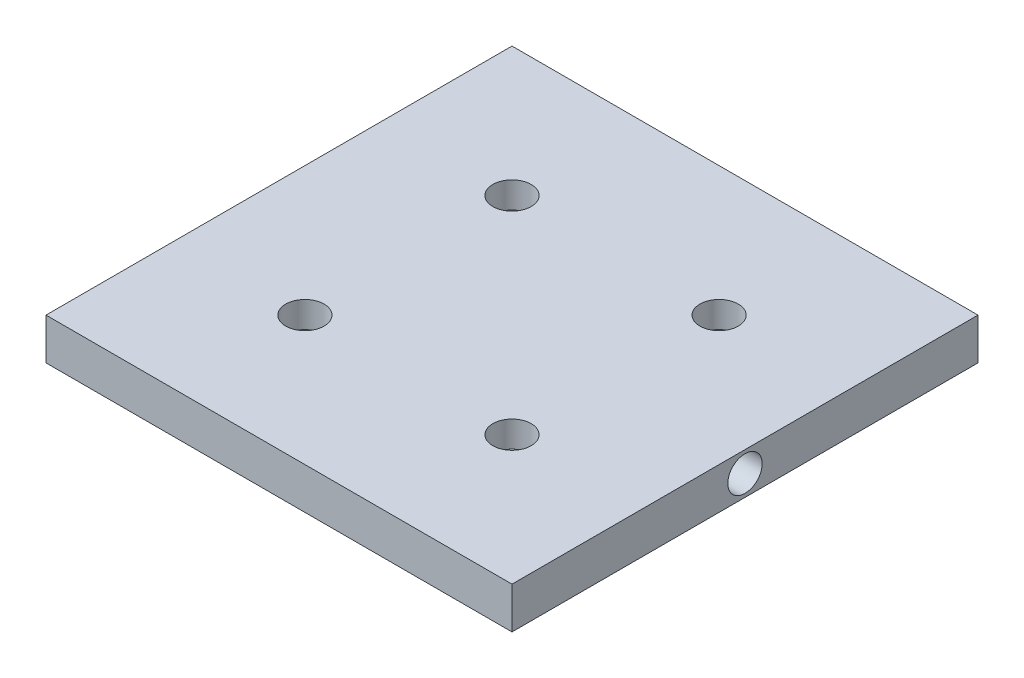
ISO-10303-21;
HEADER;
FILE_DESCRIPTION(('STEP AP214'),'2;1');
FILE_NAME('part.step','',(''),(''),'','','');
FILE_SCHEMA(('AUTOMOTIVE_DESIGN { 1 0 10303 214 1 1 1 1 }'));
ENDSEC;
DATA;
#1=APPLICATION_CONTEXT('core data for automotive mechanical design processes');
#2=APPLICATION_PROTOCOL_DEFINITION('international standard','automotive_design',2000,#1);
#3=PRODUCT_CONTEXT('',#1,'mechanical');
#4=PRODUCT('Part','Part','',(#3));
#5=PRODUCT_RELATED_PRODUCT_CATEGORY('part','',(#4));
#6=PRODUCT_DEFINITION_FORMATION('','',#4);
#7=PRODUCT_DEFINITION_CONTEXT('part definition',#1,'design');
#8=PRODUCT_DEFINITION('design','',#6,#7);
#9=PRODUCT_DEFINITION_SHAPE('','',#8);
#10=(LENGTH_UNIT() NAMED_UNIT(*) SI_UNIT(.MILLI.,.METRE.));
#11=(NAMED_UNIT(*) PLANE_ANGLE_UNIT() SI_UNIT($,.RADIAN.));
#12=(NAMED_UNIT(*) SI_UNIT($,.STERADIAN.) SOLID_ANGLE_UNIT());
#13=UNCERTAINTY_MEASURE_WITH_UNIT(LENGTH_MEASURE(1.E-05),#10,'distance_accuracy_value','');
#14=(GEOMETRIC_REPRESENTATION_CONTEXT(3) GLOBAL_UNCERTAINTY_ASSIGNED_CONTEXT((#13)) GLOBAL_UNIT_ASSIGNED_CONTEXT((#10,
#11,#12)) REPRESENTATION_CONTEXT('',''));
#15=CARTESIAN_POINT('',(0.,0.,0.));
#16=DIRECTION('',(0.,0.,1.));
#17=DIRECTION('',(1.,0.,0.));
#18=AXIS2_PLACEMENT_3D('',#15,#16,#17);
#19=CARTESIAN_POINT('',(-57.15,10.16,-57.15));
#20=DIRECTION('',(1.,0.,0.));
#21=DIRECTION('',(0.,0.,-1.));
#22=AXIS2_PLACEMENT_3D('',#19,#20,#21);
#23=PLANE('',#22);
#24=DIRECTION('',(0.,0.,1.));
#25=VECTOR('',#24,1.);
#26=CARTESIAN_POINT('',(-57.15,0.,-57.15));
#27=LINE('',#26,#25);
#28=CARTESIAN_POINT('',(-57.15,0.,-57.15));
#29=VERTEX_POINT('',#28);
#30=CARTESIAN_POINT('',(-57.15,0.,57.1499999999999));
#31=VERTEX_POINT('',#30);
#32=EDGE_CURVE('E111',#29,#31,#27,.T.);
#33=ORIENTED_EDGE('',*,*,#32,.T.);
#34=DIRECTION('',(0.,-1.,0.));
#35=VECTOR('',#34,1.);
#36=CARTESIAN_POINT('',(-57.15,10.16,57.1499999999999));
#37=LINE('',#36,#35);
#38=CARTESIAN_POINT('',(-57.15,10.16,57.1499999999999));
#39=VERTEX_POINT('',#38);
#40=EDGE_CURVE('E11',#39,#31,#37,.T.);
#41=ORIENTED_EDGE('',*,*,#40,.F.);
#42=DIRECTION('',(0.,0.,1.));
#43=VECTOR('',#42,1.);
#44=CARTESIAN_POINT('',(-57.15,10.16,-57.15));
#45=LINE('',#44,#43);
#46=CARTESIAN_POINT('',(-57.15,10.16,-57.15));
#47=VERTEX_POINT('',#46);
#48=EDGE_CURVE('E95',#47,#39,#45,.T.);
#49=ORIENTED_EDGE('',*,*,#48,.F.);
#50=DIRECTION('',(0.,-1.,0.));
#51=VECTOR('',#50,1.);
#52=CARTESIAN_POINT('',(-57.15,10.16,-57.15));
#53=LINE('',#52,#51);
#54=EDGE_CURVE('E107',#47,#29,#53,.T.);
#55=ORIENTED_EDGE('',*,*,#54,.T.);
#56=EDGE_LOOP('',(#33,#41,#49,#55));
#57=FACE_BOUND('',#56,.T.);
#58=ADVANCED_FACE('F43',(#57),#23,.F.);
#59=CARTESIAN_POINT('',(-57.15,10.16,57.1499999999999));
#60=DIRECTION('',(0.,0.,-1.));
#61=DIRECTION('',(-1.,0.,0.));
#62=AXIS2_PLACEMENT_3D('',#59,#60,#61);
#63=PLANE('',#62);
#64=DIRECTION('',(1.,0.,0.));
#65=VECTOR('',#64,1.);
#66=CARTESIAN_POINT('',(-57.15,0.,57.1499999999999));
#67=LINE('',#66,#65);
#68=CARTESIAN_POINT('',(57.15,0.,57.1499999999999));
#69=VERTEX_POINT('',#68);
#70=EDGE_CURVE('E100',#31,#69,#67,.T.);
#71=ORIENTED_EDGE('',*,*,#70,.T.);
#72=DIRECTION('',(0.,-1.,0.));
#73=VECTOR('',#72,1.);
#74=CARTESIAN_POINT('',(57.15,10.16,57.1499999999999));
#75=LINE('',#74,#73);
#76=CARTESIAN_POINT('',(57.15,10.16,57.1499999999999));
#77=VERTEX_POINT('',#76);
#78=EDGE_CURVE('E52',#77,#69,#75,.T.);
#79=ORIENTED_EDGE('',*,*,#78,.F.);
#80=DIRECTION('',(1.,0.,0.));
#81=VECTOR('',#80,1.);
#82=CARTESIAN_POINT('',(-57.15,10.16,57.1499999999999));
#83=LINE('',#82,#81);
#84=EDGE_CURVE('E90',#39,#77,#83,.T.);
#85=ORIENTED_EDGE('',*,*,#84,.F.);
#86=ORIENTED_EDGE('',*,*,#40,.T.);
#87=EDGE_LOOP('',(#71,#79,#85,#86));
#88=FACE_BOUND('',#87,.T.);
#89=ADVANCED_FACE('F99',(#88),#63,.F.);
#90=CARTESIAN_POINT('',(57.1499999999999,10.16,-57.1500000000001));
#91=DIRECTION('',(-1.,0.,0.));
#92=DIRECTION('',(0.,0.,1.));
#93=AXIS2_PLACEMENT_3D('',#90,#91,#92);
#94=PLANE('',#93);
#95=CARTESIAN_POINT('',(57.15,5.08,0.));
#96=DIRECTION('',(1.,0.,0.));
#97=DIRECTION('',(0.,0.,-1.));
#98=AXIS2_PLACEMENT_3D('',#95,#96,#97);
#99=CIRCLE('',#98,4.2164);
#100=CARTESIAN_POINT('',(57.15,5.08,-4.21640000000003));
#101=VERTEX_POINT('',#100);
#102=EDGE_CURVE('E196',#101,#101,#99,.T.);
#103=ORIENTED_EDGE('',*,*,#102,.F.);
#104=EDGE_LOOP('',(#103));
#105=FACE_BOUND('',#104,.T.);
#106=DIRECTION('',(0.,0.,-1.));
#107=VECTOR('',#106,1.);
#108=CARTESIAN_POINT('',(57.1499999999999,0.,-57.1500000000001));
#109=LINE('',#108,#107);
#110=CARTESIAN_POINT('',(57.1499999999999,0.,-57.1500000000001));
#111=VERTEX_POINT('',#110);
#112=EDGE_CURVE('E77',#69,#111,#109,.T.);
#113=ORIENTED_EDGE('',*,*,#112,.T.);
#114=DIRECTION('',(0.,-1.,0.));
#115=VECTOR('',#114,1.);
#116=CARTESIAN_POINT('',(57.1499999999999,10.16,-57.1500000000001));
#117=LINE('',#116,#115);
#118=CARTESIAN_POINT('',(57.1499999999999,10.16,-57.1500000000001));
#119=VERTEX_POINT('',#118);
#120=EDGE_CURVE('E102',#119,#111,#117,.T.);
#121=ORIENTED_EDGE('',*,*,#120,.F.);
#122=DIRECTION('',(0.,0.,-1.));
#123=VECTOR('',#122,1.);
#124=CARTESIAN_POINT('',(57.1499999999999,10.16,-57.1500000000001));
#125=LINE('',#124,#123);
#126=EDGE_CURVE('E93',#77,#119,#125,.T.);
#127=ORIENTED_EDGE('',*,*,#126,.F.);
#128=ORIENTED_EDGE('',*,*,#78,.T.);
#129=EDGE_LOOP('',(#113,#121,#127,#128));
#130=FACE_BOUND('',#129,.T.);
#131=ADVANCED_FACE('F103',(#105,#130),#94,.F.);
#132=CARTESIAN_POINT('',(-57.15,10.16,-57.15));
#133=DIRECTION('',(0.,0.,1.));
#134=DIRECTION('',(1.,0.,0.));
#135=AXIS2_PLACEMENT_3D('',#132,#133,#134);
#136=PLANE('',#135);
#137=DIRECTION('',(-1.,0.,0.));
#138=VECTOR('',#137,1.);
#139=CARTESIAN_POINT('',(-57.15,0.,-57.15));
#140=LINE('',#139,#138);
#141=EDGE_CURVE('E83',#111,#29,#140,.T.);
#142=ORIENTED_EDGE('',*,*,#141,.T.);
#143=ORIENTED_EDGE('',*,*,#54,.F.);
#144=DIRECTION('',(-1.,0.,0.));
#145=VECTOR('',#144,1.);
#146=CARTESIAN_POINT('',(-57.15,10.16,-57.15));
#147=LINE('',#146,#145);
#148=EDGE_CURVE('E60',#119,#47,#147,.T.);
#149=ORIENTED_EDGE('',*,*,#148,.F.);
#150=ORIENTED_EDGE('',*,*,#120,.T.);
#151=EDGE_LOOP('',(#142,#143,#149,#150));
#152=FACE_BOUND('',#151,.T.);
#153=ADVANCED_FACE('F125',(#152),#136,.F.);
#154=CARTESIAN_POINT('',(0.,10.16,0.));
#155=DIRECTION('',(0.,1.,0.));
#156=DIRECTION('',(0.,0.,1.));
#157=AXIS2_PLACEMENT_3D('',#154,#155,#156);
#158=PLANE('',#157);
#159=CARTESIAN_POINT('',(-25.4,10.16,-25.4000000000001));
#160=DIRECTION('',(0.,1.,0.));
#161=DIRECTION('',(0.,0.,1.));
#162=AXIS2_PLACEMENT_3D('',#159,#160,#161);
#163=CIRCLE('',#162,4.7);
#164=CARTESIAN_POINT('',(-25.4,10.16,-20.7000000000001));
#165=VERTEX_POINT('',#164);
#166=EDGE_CURVE('E191',#165,#165,#163,.T.);
#167=ORIENTED_EDGE('',*,*,#166,.F.);
#168=EDGE_LOOP('',(#167));
#169=FACE_BOUND('',#168,.T.);
#170=CARTESIAN_POINT('',(25.4,10.16,-25.4000000000002));
#171=DIRECTION('',(0.,1.,0.));
#172=DIRECTION('',(0.,0.,1.));
#173=AXIS2_PLACEMENT_3D('',#170,#171,#172);
#174=CIRCLE('',#173,4.7);
#175=CARTESIAN_POINT('',(25.4,10.16,-20.7000000000002));
#176=VERTEX_POINT('',#175);
#177=EDGE_CURVE('E175',#176,#176,#174,.T.);
#178=ORIENTED_EDGE('',*,*,#177,.F.);
#179=EDGE_LOOP('',(#178));
#180=FACE_BOUND('',#179,.T.);
#181=CARTESIAN_POINT('',(25.3999999999999,10.16,25.3999999999998));
#182=DIRECTION('',(0.,1.,0.));
#183=DIRECTION('',(0.,0.,1.));
#184=AXIS2_PLACEMENT_3D('',#181,#182,#183);
#185=CIRCLE('',#184,4.7);
#186=CARTESIAN_POINT('',(25.3999999999999,10.16,30.0999999999998));
#187=VERTEX_POINT('',#186);
#188=EDGE_CURVE('E159',#187,#187,#185,.T.);
#189=ORIENTED_EDGE('',*,*,#188,.F.);
#190=EDGE_LOOP('',(#189));
#191=FACE_BOUND('',#190,.T.);
#192=CARTESIAN_POINT('',(-25.4,10.16,25.3999999999999));
#193=DIRECTION('',(0.,1.,0.));
#194=DIRECTION('',(0.,0.,1.));
#195=AXIS2_PLACEMENT_3D('',#192,#193,#194);
#196=CIRCLE('',#195,4.7);
#197=CARTESIAN_POINT('',(-25.4,10.16,30.0999999999999));
#198=VERTEX_POINT('',#197);
#199=EDGE_CURVE('E143',#198,#198,#196,.T.);
#200=ORIENTED_EDGE('',*,*,#199,.F.);
#201=EDGE_LOOP('',(#200));
#202=FACE_BOUND('',#201,.T.);
#203=ORIENTED_EDGE('',*,*,#48,.T.);
#204=ORIENTED_EDGE('',*,*,#84,.T.);
#205=ORIENTED_EDGE('',*,*,#126,.T.);
#206=ORIENTED_EDGE('',*,*,#148,.T.);
#207=EDGE_LOOP('',(#203,#204,#205,#206));
#208=FACE_BOUND('',#207,.T.);
#209=ADVANCED_FACE('F91',(#169,#180,#191,#202,#208),#158,.T.);
#210=CARTESIAN_POINT('',(0.,0.,0.));
#211=DIRECTION('',(0.,1.,0.));
#212=DIRECTION('',(0.,0.,1.));
#213=AXIS2_PLACEMENT_3D('',#210,#211,#212);
#214=PLANE('',#213);
#215=CARTESIAN_POINT('',(-25.4,0.,-25.4000000000001));
#216=DIRECTION('',(0.,1.,0.));
#217=DIRECTION('',(0.,0.,1.));
#218=AXIS2_PLACEMENT_3D('',#215,#216,#217);
#219=CIRCLE('',#218,3.3);
#220=CARTESIAN_POINT('',(-25.4,0.,-22.1000000000001));
#221=VERTEX_POINT('',#220);
#222=EDGE_CURVE('E179',#221,#221,#219,.T.);
#223=ORIENTED_EDGE('',*,*,#222,.T.);
#224=EDGE_LOOP('',(#223));
#225=FACE_BOUND('',#224,.T.);
#226=CARTESIAN_POINT('',(25.4,0.,-25.4000000000002));
#227=DIRECTION('',(0.,1.,0.));
#228=DIRECTION('',(0.,0.,1.));
#229=AXIS2_PLACEMENT_3D('',#226,#227,#228);
#230=CIRCLE('',#229,3.3);
#231=CARTESIAN_POINT('',(25.4,0.,-22.1000000000002));
#232=VERTEX_POINT('',#231);
#233=EDGE_CURVE('E163',#232,#232,#230,.T.);
#234=ORIENTED_EDGE('',*,*,#233,.T.);
#235=EDGE_LOOP('',(#234));
#236=FACE_BOUND('',#235,.T.);
#237=CARTESIAN_POINT('',(25.3999999999999,0.,25.3999999999998));
#238=DIRECTION('',(0.,1.,0.));
#239=DIRECTION('',(0.,0.,1.));
#240=AXIS2_PLACEMENT_3D('',#237,#238,#239);
#241=CIRCLE('',#240,3.3);
#242=CARTESIAN_POINT('',(25.3999999999999,0.,28.6999999999998));
#243=VERTEX_POINT('',#242);
#244=EDGE_CURVE('E147',#243,#243,#241,.T.);
#245=ORIENTED_EDGE('',*,*,#244,.T.);
#246=EDGE_LOOP('',(#245));
#247=FACE_BOUND('',#246,.T.);
#248=CARTESIAN_POINT('',(-25.4,0.,25.3999999999999));
#249=DIRECTION('',(0.,1.,0.));
#250=DIRECTION('',(0.,0.,1.));
#251=AXIS2_PLACEMENT_3D('',#248,#249,#250);
#252=CIRCLE('',#251,3.3);
#253=CARTESIAN_POINT('',(-25.4,0.,28.6999999999999));
#254=VERTEX_POINT('',#253);
#255=EDGE_CURVE('E115',#254,#254,#252,.T.);
#256=ORIENTED_EDGE('',*,*,#255,.T.);
#257=EDGE_LOOP('',(#256));
#258=FACE_BOUND('',#257,.T.);
#259=ORIENTED_EDGE('',*,*,#32,.F.);
#260=ORIENTED_EDGE('',*,*,#141,.F.);
#261=ORIENTED_EDGE('',*,*,#112,.F.);
#262=ORIENTED_EDGE('',*,*,#70,.F.);
#263=EDGE_LOOP('',(#259,#260,#261,#262));
#264=FACE_BOUND('',#263,.T.);
#265=ADVANCED_FACE('F128',(#225,#236,#247,#258,#264),#214,.F.);
#266=CARTESIAN_POINT('',(-25.4,10.16,25.3999999999999));
#267=DIRECTION('',(0.,1.,0.));
#268=DIRECTION('',(0.,0.,1.));
#269=AXIS2_PLACEMENT_3D('',#266,#267,#268);
#270=CYLINDRICAL_SURFACE('',#269,3.3);
#271=ORIENTED_EDGE('',*,*,#255,.F.);
#272=EDGE_LOOP('',(#271));
#273=FACE_BOUND('',#272,.T.);
#274=CARTESIAN_POINT('',(-25.4,3.76,25.3999999999999));
#275=DIRECTION('',(0.,1.,0.));
#276=DIRECTION('',(0.,0.,1.));
#277=AXIS2_PLACEMENT_3D('',#274,#275,#276);
#278=CIRCLE('',#277,3.3);
#279=CARTESIAN_POINT('',(-25.4,3.76,28.6999999999999));
#280=VERTEX_POINT('',#279);
#281=EDGE_CURVE('E135',#280,#280,#278,.T.);
#282=ORIENTED_EDGE('',*,*,#281,.T.);
#283=EDGE_LOOP('',(#282));
#284=FACE_BOUND('',#283,.T.);
#285=ADVANCED_FACE('F255',(#273,#284),#270,.F.);
#286=CARTESIAN_POINT('',(-22.1000000000001,3.76,25.3999999999999));
#287=DIRECTION('',(0.,-1.,0.));
#288=DIRECTION('',(0.,0.,-1.));
#289=AXIS2_PLACEMENT_3D('',#286,#287,#288);
#290=PLANE('',#289);
#291=ORIENTED_EDGE('',*,*,#281,.F.);
#292=EDGE_LOOP('',(#291));
#293=FACE_BOUND('',#292,.T.);
#294=CARTESIAN_POINT('',(-25.4,3.76,25.3999999999999));
#295=DIRECTION('',(0.,1.,0.));
#296=DIRECTION('',(0.,0.,1.));
#297=AXIS2_PLACEMENT_3D('',#294,#295,#296);
#298=CIRCLE('',#297,4.7);
#299=CARTESIAN_POINT('',(-25.4,3.76,30.0999999999999));
#300=VERTEX_POINT('',#299);
#301=EDGE_CURVE('E139',#300,#300,#298,.T.);
#302=ORIENTED_EDGE('',*,*,#301,.T.);
#303=EDGE_LOOP('',(#302));
#304=FACE_BOUND('',#303,.T.);
#305=ADVANCED_FACE('F266',(#293,#304),#290,.F.);
#306=CARTESIAN_POINT('',(-25.4,10.16,25.3999999999999));
#307=DIRECTION('',(0.,1.,0.));
#308=DIRECTION('',(0.,0.,1.));
#309=AXIS2_PLACEMENT_3D('',#306,#307,#308);
#310=CYLINDRICAL_SURFACE('',#309,4.7);
#311=ORIENTED_EDGE('',*,*,#301,.F.);
#312=EDGE_LOOP('',(#311));
#313=FACE_BOUND('',#312,.T.);
#314=ORIENTED_EDGE('',*,*,#199,.T.);
#315=EDGE_LOOP('',(#314));
#316=FACE_BOUND('',#315,.T.);
#317=ADVANCED_FACE('F277',(#313,#316),#310,.F.);
#318=CARTESIAN_POINT('',(25.3999999999999,10.16,25.3999999999998));
#319=DIRECTION('',(0.,1.,0.));
#320=DIRECTION('',(0.,0.,1.));
#321=AXIS2_PLACEMENT_3D('',#318,#319,#320);
#322=CYLINDRICAL_SURFACE('',#321,3.3);
#323=ORIENTED_EDGE('',*,*,#244,.F.);
#324=EDGE_LOOP('',(#323));
#325=FACE_BOUND('',#324,.T.);
#326=CARTESIAN_POINT('',(25.3999999999999,3.76,25.3999999999998));
#327=DIRECTION('',(0.,1.,0.));
#328=DIRECTION('',(0.,0.,1.));
#329=AXIS2_PLACEMENT_3D('',#326,#327,#328);
#330=CIRCLE('',#329,3.3);
#331=CARTESIAN_POINT('',(25.3999999999999,3.76,28.6999999999998));
#332=VERTEX_POINT('',#331);
#333=EDGE_CURVE('E151',#332,#332,#330,.T.);
#334=ORIENTED_EDGE('',*,*,#333,.T.);
#335=EDGE_LOOP('',(#334));
#336=FACE_BOUND('',#335,.T.);
#337=ADVANCED_FACE('F288',(#325,#336),#322,.F.);
#338=CARTESIAN_POINT('',(28.6999999999999,3.76,25.3999999999998));
#339=DIRECTION('',(0.,-1.,0.));
#340=DIRECTION('',(0.,0.,-1.));
#341=AXIS2_PLACEMENT_3D('',#338,#339,#340);
#342=PLANE('',#341);
#343=ORIENTED_EDGE('',*,*,#333,.F.);
#344=EDGE_LOOP('',(#343));
#345=FACE_BOUND('',#344,.T.);
#346=CARTESIAN_POINT('',(25.3999999999999,3.76,25.3999999999998));
#347=DIRECTION('',(0.,1.,0.));
#348=DIRECTION('',(0.,0.,1.));
#349=AXIS2_PLACEMENT_3D('',#346,#347,#348);
#350=CIRCLE('',#349,4.7);
#351=CARTESIAN_POINT('',(25.3999999999999,3.76,30.0999999999998));
#352=VERTEX_POINT('',#351);
#353=EDGE_CURVE('E155',#352,#352,#350,.T.);
#354=ORIENTED_EDGE('',*,*,#353,.T.);
#355=EDGE_LOOP('',(#354));
#356=FACE_BOUND('',#355,.T.);
#357=ADVANCED_FACE('F299',(#345,#356),#342,.F.);
#358=CARTESIAN_POINT('',(25.3999999999999,10.16,25.3999999999998));
#359=DIRECTION('',(0.,1.,0.));
#360=DIRECTION('',(0.,0.,1.));
#361=AXIS2_PLACEMENT_3D('',#358,#359,#360);
#362=CYLINDRICAL_SURFACE('',#361,4.7);
#363=ORIENTED_EDGE('',*,*,#353,.F.);
#364=EDGE_LOOP('',(#363));
#365=FACE_BOUND('',#364,.T.);
#366=ORIENTED_EDGE('',*,*,#188,.T.);
#367=EDGE_LOOP('',(#366));
#368=FACE_BOUND('',#367,.T.);
#369=ADVANCED_FACE('F310',(#365,#368),#362,.F.);
#370=CARTESIAN_POINT('',(25.4,10.16,-25.4000000000002));
#371=DIRECTION('',(0.,1.,0.));
#372=DIRECTION('',(0.,0.,1.));
#373=AXIS2_PLACEMENT_3D('',#370,#371,#372);
#374=CYLINDRICAL_SURFACE('',#373,3.3);
#375=ORIENTED_EDGE('',*,*,#233,.F.);
#376=EDGE_LOOP('',(#375));
#377=FACE_BOUND('',#376,.T.);
#378=CARTESIAN_POINT('',(25.4,3.76,-25.4000000000002));
#379=DIRECTION('',(0.,1.,0.));
#380=DIRECTION('',(0.,0.,1.));
#381=AXIS2_PLACEMENT_3D('',#378,#379,#380);
#382=CIRCLE('',#381,3.3);
#383=CARTESIAN_POINT('',(25.4,3.76,-22.1000000000002));
#384=VERTEX_POINT('',#383);
#385=EDGE_CURVE('E167',#384,#384,#382,.T.);
#386=ORIENTED_EDGE('',*,*,#385,.T.);
#387=EDGE_LOOP('',(#386));
#388=FACE_BOUND('',#387,.T.);
#389=ADVANCED_FACE('F321',(#377,#388),#374,.F.);
#390=CARTESIAN_POINT('',(28.7,3.76,-25.4000000000002));
#391=DIRECTION('',(0.,-1.,0.));
#392=DIRECTION('',(0.,0.,-1.));
#393=AXIS2_PLACEMENT_3D('',#390,#391,#392);
#394=PLANE('',#393);
#395=ORIENTED_EDGE('',*,*,#385,.F.);
#396=EDGE_LOOP('',(#395));
#397=FACE_BOUND('',#396,.T.);
#398=CARTESIAN_POINT('',(25.4,3.76,-25.4000000000002));
#399=DIRECTION('',(0.,1.,0.));
#400=DIRECTION('',(0.,0.,1.));
#401=AXIS2_PLACEMENT_3D('',#398,#399,#400);
#402=CIRCLE('',#401,4.7);
#403=CARTESIAN_POINT('',(25.4,3.76,-20.7000000000002));
#404=VERTEX_POINT('',#403);
#405=EDGE_CURVE('E171',#404,#404,#402,.T.);
#406=ORIENTED_EDGE('',*,*,#405,.T.);
#407=EDGE_LOOP('',(#406));
#408=FACE_BOUND('',#407,.T.);
#409=ADVANCED_FACE('F332',(#397,#408),#394,.F.);
#410=CARTESIAN_POINT('',(25.4,10.16,-25.4000000000002));
#411=DIRECTION('',(0.,1.,0.));
#412=DIRECTION('',(0.,0.,1.));
#413=AXIS2_PLACEMENT_3D('',#410,#411,#412);
#414=CYLINDRICAL_SURFACE('',#413,4.7);
#415=ORIENTED_EDGE('',*,*,#405,.F.);
#416=EDGE_LOOP('',(#415));
#417=FACE_BOUND('',#416,.T.);
#418=ORIENTED_EDGE('',*,*,#177,.T.);
#419=EDGE_LOOP('',(#418));
#420=FACE_BOUND('',#419,.T.);
#421=ADVANCED_FACE('F343',(#417,#420),#414,.F.);
#422=CARTESIAN_POINT('',(-25.4,10.16,-25.4000000000001));
#423=DIRECTION('',(0.,1.,0.));
#424=DIRECTION('',(0.,0.,1.));
#425=AXIS2_PLACEMENT_3D('',#422,#423,#424);
#426=CYLINDRICAL_SURFACE('',#425,3.3);
#427=ORIENTED_EDGE('',*,*,#222,.F.);
#428=EDGE_LOOP('',(#427));
#429=FACE_BOUND('',#428,.T.);
#430=CARTESIAN_POINT('',(-25.4,3.76,-25.4000000000001));
#431=DIRECTION('',(0.,1.,0.));
#432=DIRECTION('',(0.,0.,1.));
#433=AXIS2_PLACEMENT_3D('',#430,#431,#432);
#434=CIRCLE('',#433,3.3);
#435=CARTESIAN_POINT('',(-25.4,3.76,-22.1000000000001));
#436=VERTEX_POINT('',#435);
#437=EDGE_CURVE('E183',#436,#436,#434,.T.);
#438=ORIENTED_EDGE('',*,*,#437,.T.);
#439=EDGE_LOOP('',(#438));
#440=FACE_BOUND('',#439,.T.);
#441=ADVANCED_FACE('F354',(#429,#440),#426,.F.);
#442=CARTESIAN_POINT('',(-22.1,3.76,-25.4000000000001));
#443=DIRECTION('',(0.,-1.,0.));
#444=DIRECTION('',(0.,0.,-1.));
#445=AXIS2_PLACEMENT_3D('',#442,#443,#444);
#446=PLANE('',#445);
#447=ORIENTED_EDGE('',*,*,#437,.F.);
#448=EDGE_LOOP('',(#447));
#449=FACE_BOUND('',#448,.T.);
#450=CARTESIAN_POINT('',(-25.4,3.76,-25.4000000000001));
#451=DIRECTION('',(0.,1.,0.));
#452=DIRECTION('',(0.,0.,1.));
#453=AXIS2_PLACEMENT_3D('',#450,#451,#452);
#454=CIRCLE('',#453,4.7);
#455=CARTESIAN_POINT('',(-25.4,3.76,-20.7000000000001));
#456=VERTEX_POINT('',#455);
#457=EDGE_CURVE('E187',#456,#456,#454,.T.);
#458=ORIENTED_EDGE('',*,*,#457,.T.);
#459=EDGE_LOOP('',(#458));
#460=FACE_BOUND('',#459,.T.);
#461=ADVANCED_FACE('F365',(#449,#460),#446,.F.);
#462=CARTESIAN_POINT('',(-25.4,10.16,-25.4000000000001));
#463=DIRECTION('',(0.,1.,0.));
#464=DIRECTION('',(0.,0.,1.));
#465=AXIS2_PLACEMENT_3D('',#462,#463,#464);
#466=CYLINDRICAL_SURFACE('',#465,4.7);
#467=ORIENTED_EDGE('',*,*,#457,.F.);
#468=EDGE_LOOP('',(#467));
#469=FACE_BOUND('',#468,.T.);
#470=ORIENTED_EDGE('',*,*,#166,.T.);
#471=EDGE_LOOP('',(#470));
#472=FACE_BOUND('',#471,.T.);
#473=ADVANCED_FACE('F209',(#469,#472),#466,.F.);
#474=CARTESIAN_POINT('',(43.18,5.08,0.));
#475=DIRECTION('',(1.,0.,0.));
#476=DIRECTION('',(0.,0.,-1.));
#477=AXIS2_PLACEMENT_3D('',#474,#475,#476);
#478=CYLINDRICAL_SURFACE('',#477,4.2164);
#479=CARTESIAN_POINT('',(43.18,5.08,0.));
#480=DIRECTION('',(1.,0.,0.));
#481=DIRECTION('',(0.,0.,-1.));
#482=AXIS2_PLACEMENT_3D('',#479,#480,#481);
#483=CIRCLE('',#482,4.2164);
#484=CARTESIAN_POINT('',(43.18,5.08,-4.21640000000002));
#485=VERTEX_POINT('',#484);
#486=EDGE_CURVE('E195',#485,#485,#483,.T.);
#487=ORIENTED_EDGE('',*,*,#486,.F.);
#488=EDGE_LOOP('',(#487));
#489=FACE_BOUND('',#488,.T.);
#490=ORIENTED_EDGE('',*,*,#102,.T.);
#491=EDGE_LOOP('',(#490));
#492=FACE_BOUND('',#491,.T.);
#493=ADVANCED_FACE('F206',(#489,#492),#478,.F.);
#494=CARTESIAN_POINT('',(43.18,5.08,0.));
#495=DIRECTION('',(1.,0.,0.));
#496=DIRECTION('',(0.,0.,-1.));
#497=AXIS2_PLACEMENT_3D('',#494,#495,#496);
#498=PLANE('',#497);
#499=ORIENTED_EDGE('',*,*,#486,.T.);
#500=EDGE_LOOP('',(#499));
#501=FACE_BOUND('',#500,.T.);
#502=ADVANCED_FACE('F204',(#501),#498,.T.);
#503=CLOSED_SHELL('',(#58,#89,#131,#153,#209,#265,#285,#305,#317,#337,#357,#369,#389,#409,#421,
#441,#461,#473,#493,#502));
#504=MANIFOLD_SOLID_BREP('B2',#503);
#505=ADVANCED_BREP_SHAPE_REPRESENTATION('',(#18,#504),#14);
#506=SHAPE_DEFINITION_REPRESENTATION(#9,#505);
ENDSEC;
END-ISO-10303-21;
